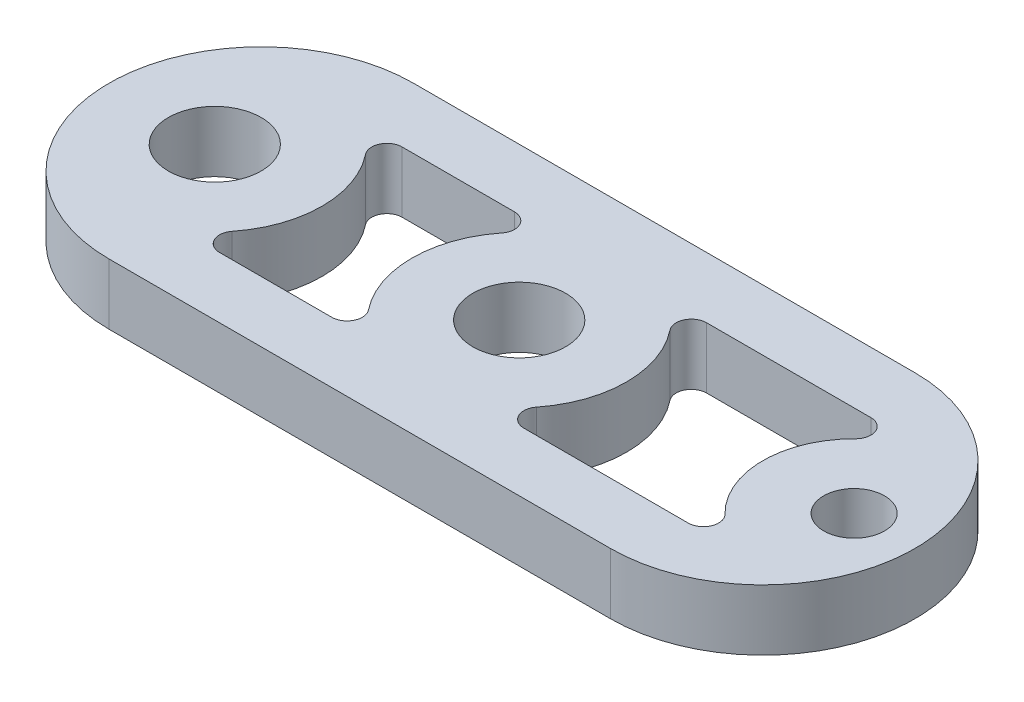
ISO-10303-21;
HEADER;
FILE_DESCRIPTION(('STEP AP214'),'2;1');
FILE_NAME('part.step','',(''),(''),'','','');
FILE_SCHEMA(('AUTOMOTIVE_DESIGN { 1 0 10303 214 1 1 1 1 }'));
ENDSEC;
DATA;
#1=APPLICATION_CONTEXT('core data for automotive mechanical design processes');
#2=APPLICATION_PROTOCOL_DEFINITION('international standard','automotive_design',2000,#1);
#3=PRODUCT_CONTEXT('',#1,'mechanical');
#4=PRODUCT('Part','Part','',(#3));
#5=PRODUCT_RELATED_PRODUCT_CATEGORY('part','',(#4));
#6=PRODUCT_DEFINITION_FORMATION('','',#4);
#7=PRODUCT_DEFINITION_CONTEXT('part definition',#1,'design');
#8=PRODUCT_DEFINITION('design','',#6,#7);
#9=PRODUCT_DEFINITION_SHAPE('','',#8);
#10=(LENGTH_UNIT() NAMED_UNIT(*) SI_UNIT(.MILLI.,.METRE.));
#11=(NAMED_UNIT(*) PLANE_ANGLE_UNIT() SI_UNIT($,.RADIAN.));
#12=(NAMED_UNIT(*) SI_UNIT($,.STERADIAN.) SOLID_ANGLE_UNIT());
#13=UNCERTAINTY_MEASURE_WITH_UNIT(LENGTH_MEASURE(1.E-05),#10,'distance_accuracy_value','');
#14=(GEOMETRIC_REPRESENTATION_CONTEXT(3) GLOBAL_UNCERTAINTY_ASSIGNED_CONTEXT((#13)) GLOBAL_UNIT_ASSIGNED_CONTEXT((#10,
#11,#12)) REPRESENTATION_CONTEXT('',''));
#15=CARTESIAN_POINT('',(0.,0.,0.));
#16=DIRECTION('',(0.,0.,1.));
#17=DIRECTION('',(1.,0.,0.));
#18=AXIS2_PLACEMENT_3D('',#15,#16,#17);
#19=CARTESIAN_POINT('',(3.04999999999778,4.,-1.47391864338542E-12));
#20=DIRECTION('',(0.,1.,0.));
#21=DIRECTION('',(0.,0.,1.));
#22=AXIS2_PLACEMENT_3D('',#19,#20,#21);
#23=PLANE('',#22);
#24=CARTESIAN_POINT('',(-2.23085439010617E-12,4.,-1.47391864338542E-12));
#25=DIRECTION('',(0.,1.,0.));
#26=DIRECTION('',(0.,0.,1.));
#27=AXIS2_PLACEMENT_3D('',#24,#25,#26);
#28=CIRCLE('',#27,3.05000000000001);
#29=CARTESIAN_POINT('',(-2.23085439010617E-12,4.,3.04999999999854));
#30=VERTEX_POINT('',#29);
#31=EDGE_CURVE('E209',#30,#30,#28,.T.);
#32=ORIENTED_EDGE('',*,*,#31,.F.);
#33=EDGE_LOOP('',(#32));
#34=FACE_BOUND('',#33,.T.);
#35=CARTESIAN_POINT('',(3.04999999999778,4.,-1.47391864338542E-12));
#36=DIRECTION('',(0.,1.,0.));
#37=DIRECTION('',(0.,0.,1.));
#38=AXIS2_PLACEMENT_3D('',#35,#36,#37);
#39=CIRCLE('',#38,10.);
#40=CARTESIAN_POINT('',(3.04999999999778,4.,-10.000000000001));
#41=VERTEX_POINT('',#40);
#42=CARTESIAN_POINT('',(3.04999999999778,4.,9.999999999999));
#43=VERTEX_POINT('',#42);
#44=EDGE_CURVE('E304',#41,#43,#39,.T.);
#45=ORIENTED_EDGE('',*,*,#44,.T.);
#46=DIRECTION('',(1.,0.,0.));
#47=VECTOR('',#46,1.);
#48=CARTESIAN_POINT('',(3.04999999999778,4.,9.999999999999));
#49=LINE('',#48,#47);
#50=CARTESIAN_POINT('',(35.9999999999952,4.,9.999999999999));
#51=VERTEX_POINT('',#50);
#52=EDGE_CURVE('E307',#43,#51,#49,.T.);
#53=ORIENTED_EDGE('',*,*,#52,.T.);
#54=CARTESIAN_POINT('',(35.9999999999952,4.,-9.95568644884814E-13));
#55=DIRECTION('',(0.,1.,0.));
#56=DIRECTION('',(0.,0.,1.));
#57=AXIS2_PLACEMENT_3D('',#54,#55,#56);
#58=CIRCLE('',#57,10.);
#59=CARTESIAN_POINT('',(35.9999999999952,4.,-10.000000000001));
#60=VERTEX_POINT('',#59);
#61=EDGE_CURVE('E310',#51,#60,#58,.T.);
#62=ORIENTED_EDGE('',*,*,#61,.T.);
#63=DIRECTION('',(-1.,0.,0.));
#64=VECTOR('',#63,1.);
#65=CARTESIAN_POINT('',(3.04999999999778,4.,-10.000000000001));
#66=LINE('',#65,#64);
#67=EDGE_CURVE('E312',#60,#41,#66,.T.);
#68=ORIENTED_EDGE('',*,*,#67,.T.);
#69=EDGE_LOOP('',(#45,#53,#62,#68));
#70=FACE_BOUND('',#69,.T.);
#71=CARTESIAN_POINT('',(41.9999999999968,4.,-9.95568644884814E-13));
#72=DIRECTION('',(0.,1.,0.));
#73=DIRECTION('',(0.,0.,1.));
#74=AXIS2_PLACEMENT_3D('',#71,#72,#73);
#75=CIRCLE('',#74,2.);
#76=CARTESIAN_POINT('',(41.9999999999968,4.,1.999999999999));
#77=VERTEX_POINT('',#76);
#78=EDGE_CURVE('E298',#77,#77,#75,.T.);
#79=ORIENTED_EDGE('',*,*,#78,.F.);
#80=EDGE_LOOP('',(#79));
#81=FACE_BOUND('',#80,.T.);
#82=DIRECTION('',(-1.,0.,0.));
#83=VECTOR('',#82,1.);
#84=CARTESIAN_POINT('',(26.3089222534407,4.,-6.0000000000038));
#85=LINE('',#84,#83);
#86=CARTESIAN_POINT('',(37.1010205144309,4.,-6.0000000000038));
#87=VERTEX_POINT('',#86);
#88=CARTESIAN_POINT('',(26.3089222534407,4.,-6.0000000000038));
#89=VERTEX_POINT('',#88);
#90=EDGE_CURVE('E241',#87,#89,#85,.T.);
#91=ORIENTED_EDGE('',*,*,#90,.F.);
#92=CARTESIAN_POINT('',(37.1010205144309,4.,-5.0000000000038));
#93=DIRECTION('',(0.,1.,0.));
#94=DIRECTION('',(0.,0.,-1.));
#95=AXIS2_PLACEMENT_3D('',#92,#93,#94);
#96=CIRCLE('',#95,1.);
#97=CARTESIAN_POINT('',(37.8008747266545,4.,-4.28571428571789));
#98=VERTEX_POINT('',#97);
#99=EDGE_CURVE('E239',#98,#87,#96,.T.);
#100=ORIENTED_EDGE('',*,*,#99,.F.);
#101=CARTESIAN_POINT('',(41.9999999999972,4.,-9.95568644884814E-13));
#102=DIRECTION('',(0.,-1.,0.));
#103=DIRECTION('',(0.,0.,1.));
#104=AXIS2_PLACEMENT_3D('',#101,#102,#103);
#105=CIRCLE('',#104,6.00000000000196);
#106=CARTESIAN_POINT('',(37.8008747266547,4.,4.28571428571609));
#107=VERTEX_POINT('',#106);
#108=EDGE_CURVE('E255',#107,#98,#105,.T.);
#109=ORIENTED_EDGE('',*,*,#108,.F.);
#110=CARTESIAN_POINT('',(37.1010205144309,4.,5.00000000000181));
#111=DIRECTION('',(0.,1.,0.));
#112=DIRECTION('',(0.,0.,1.));
#113=AXIS2_PLACEMENT_3D('',#110,#111,#112);
#114=CIRCLE('',#113,1.);
#115=CARTESIAN_POINT('',(37.1010205144309,4.,6.00000000000181));
#116=VERTEX_POINT('',#115);
#117=EDGE_CURVE('E252',#116,#107,#114,.T.);
#118=ORIENTED_EDGE('',*,*,#117,.F.);
#119=DIRECTION('',(1.,0.,0.));
#120=VECTOR('',#119,1.);
#121=CARTESIAN_POINT('',(26.3089222534427,4.,6.00000000000181));
#122=LINE('',#121,#120);
#123=CARTESIAN_POINT('',(26.3089222534427,4.,6.00000000000181));
#124=VERTEX_POINT('',#123);
#125=EDGE_CURVE('E250',#124,#116,#122,.T.);
#126=ORIENTED_EDGE('',*,*,#125,.F.);
#127=CARTESIAN_POINT('',(26.3089222534427,4.,5.00000000000181));
#128=DIRECTION('',(0.,1.,0.));
#129=DIRECTION('',(0.,0.,-1.));
#130=AXIS2_PLACEMENT_3D('',#127,#128,#129);
#131=CIRCLE('',#130,1.);
#132=CARTESIAN_POINT('',(25.5252052033252,4.,4.3788819875797));
#133=VERTEX_POINT('',#132);
#134=EDGE_CURVE('E248',#133,#124,#131,.T.);
#135=ORIENTED_EDGE('',*,*,#134,.F.);
#136=CARTESIAN_POINT('',(19.9999999999981,4.,2.25026160899366E-13));
#137=DIRECTION('',(0.,-1.,0.));
#138=DIRECTION('',(0.,0.,1.));
#139=AXIS2_PLACEMENT_3D('',#136,#137,#138);
#140=CIRCLE('',#139,7.0500000000015);
#141=CARTESIAN_POINT('',(25.5252052033238,4.,-4.37888198758106));
#142=VERTEX_POINT('',#141);
#143=EDGE_CURVE('E246',#142,#133,#140,.T.);
#144=ORIENTED_EDGE('',*,*,#143,.F.);
#145=CARTESIAN_POINT('',(26.3089222534407,4.,-5.0000000000038));
#146=DIRECTION('',(0.,1.,0.));
#147=DIRECTION('',(0.,0.,1.));
#148=AXIS2_PLACEMENT_3D('',#145,#146,#147);
#149=CIRCLE('',#148,1.);
#150=EDGE_CURVE('E244',#89,#142,#149,.T.);
#151=ORIENTED_EDGE('',*,*,#150,.F.);
#152=EDGE_LOOP('',(#91,#100,#109,#118,#126,#135,#144,#151));
#153=FACE_BOUND('',#152,.T.);
#154=CARTESIAN_POINT('',(0.,4.,-3.51727296972795E-12));
#155=DIRECTION('',(0.,-1.,0.));
#156=DIRECTION('',(0.,0.,1.));
#157=AXIS2_PLACEMENT_3D('',#154,#155,#156);
#158=CIRCLE('',#157,7.05000000000055);
#159=CARTESIAN_POINT('',(5.52520520332706,4.,-4.37888198758155));
#160=VERTEX_POINT('',#159);
#161=CARTESIAN_POINT('',(5.52520520332479,4.,4.37888198757724));
#162=VERTEX_POINT('',#161);
#163=EDGE_CURVE('E179',#160,#162,#158,.T.);
#164=ORIENTED_EDGE('',*,*,#163,.F.);
#165=CARTESIAN_POINT('',(6.30892225344428,4.,-5.00000000000358));
#166=DIRECTION('',(0.,1.,0.));
#167=DIRECTION('',(0.,0.,1.));
#168=AXIS2_PLACEMENT_3D('',#165,#166,#167);
#169=CIRCLE('',#168,1.00000000000008);
#170=CARTESIAN_POINT('',(6.30892225344428,4.,-6.00000000000391));
#171=VERTEX_POINT('',#170);
#172=EDGE_CURVE('E171',#171,#160,#169,.T.);
#173=ORIENTED_EDGE('',*,*,#172,.F.);
#174=DIRECTION('',(-1.,0.,0.));
#175=VECTOR('',#174,1.);
#176=CARTESIAN_POINT('',(6.30892225344428,4.,-6.00000000000391));
#177=LINE('',#176,#175);
#178=CARTESIAN_POINT('',(13.6910777465553,4.,-6.00000000000359));
#179=VERTEX_POINT('',#178);
#180=EDGE_CURVE('E206',#179,#171,#177,.T.);
#181=ORIENTED_EDGE('',*,*,#180,.F.);
#182=CARTESIAN_POINT('',(13.6910777465553,4.,-5.00000000000359));
#183=DIRECTION('',(0.,1.,0.));
#184=DIRECTION('',(0.,0.,-1.));
#185=AXIS2_PLACEMENT_3D('',#182,#183,#184);
#186=CIRCLE('',#185,1.);
#187=CARTESIAN_POINT('',(14.4747947966722,4.,-4.37888198758087));
#188=VERTEX_POINT('',#187);
#189=EDGE_CURVE('E204',#188,#179,#186,.T.);
#190=ORIENTED_EDGE('',*,*,#189,.F.);
#191=CARTESIAN_POINT('',(19.9999999999981,4.,2.25026160899366E-13));
#192=DIRECTION('',(0.,-1.,0.));
#193=DIRECTION('',(0.,0.,1.));
#194=AXIS2_PLACEMENT_3D('',#191,#192,#193);
#195=CIRCLE('',#194,7.0500000000015);
#196=CARTESIAN_POINT('',(14.4747947966692,4.,4.37888198757747));
#197=VERTEX_POINT('',#196);
#198=EDGE_CURVE('E202',#197,#188,#195,.T.);
#199=ORIENTED_EDGE('',*,*,#198,.F.);
#200=CARTESIAN_POINT('',(13.6910777465518,4.,4.99999999999964));
#201=DIRECTION('',(0.,1.,0.));
#202=DIRECTION('',(0.,0.,1.));
#203=AXIS2_PLACEMENT_3D('',#200,#201,#202);
#204=CIRCLE('',#203,1.);
#205=CARTESIAN_POINT('',(13.6910777465523,4.,5.99999999999964));
#206=VERTEX_POINT('',#205);
#207=EDGE_CURVE('E200',#206,#197,#204,.T.);
#208=ORIENTED_EDGE('',*,*,#207,.F.);
#209=DIRECTION('',(1.,0.,0.));
#210=VECTOR('',#209,1.);
#211=CARTESIAN_POINT('',(6.30892225344184,4.,5.99999999999964));
#212=LINE('',#211,#210);
#213=CARTESIAN_POINT('',(6.30892225344184,4.,5.99999999999964));
#214=VERTEX_POINT('',#213);
#215=EDGE_CURVE('E195',#214,#206,#212,.T.);
#216=ORIENTED_EDGE('',*,*,#215,.F.);
#217=CARTESIAN_POINT('',(6.30892225344184,4.,4.99999999999964));
#218=DIRECTION('',(0.,1.,0.));
#219=DIRECTION('',(0.,0.,-1.));
#220=AXIS2_PLACEMENT_3D('',#217,#218,#219);
#221=CIRCLE('',#220,0.999999999999858);
#222=EDGE_CURVE('E193',#162,#214,#221,.T.);
#223=ORIENTED_EDGE('',*,*,#222,.F.);
#224=EDGE_LOOP('',(#164,#173,#181,#190,#199,#208,#216,#223));
#225=FACE_BOUND('',#224,.T.);
#226=CARTESIAN_POINT('',(19.9999999999968,4.,-9.0839879021698E-13));
#227=DIRECTION('',(0.,1.,0.));
#228=DIRECTION('',(0.,0.,1.));
#229=AXIS2_PLACEMENT_3D('',#226,#227,#228);
#230=CIRCLE('',#229,3.05000000000148);
#231=CARTESIAN_POINT('',(19.9999999999968,4.,3.05000000000057));
#232=VERTEX_POINT('',#231);
#233=EDGE_CURVE('E392',#232,#232,#230,.T.);
#234=ORIENTED_EDGE('',*,*,#233,.F.);
#235=EDGE_LOOP('',(#234));
#236=FACE_BOUND('',#235,.T.);
#237=ADVANCED_FACE('F34',(#34,#70,#81,#153,#225,#236),#23,.T.);
#238=CARTESIAN_POINT('',(3.04999999999778,0.,-1.47391864338542E-12));
#239=DIRECTION('',(0.,1.,0.));
#240=DIRECTION('',(0.,0.,1.));
#241=AXIS2_PLACEMENT_3D('',#238,#239,#240);
#242=PLANE('',#241);
#243=CARTESIAN_POINT('',(37.1010205144309,0.,-5.0000000000038));
#244=DIRECTION('',(0.,1.,0.));
#245=DIRECTION('',(0.,0.,-1.));
#246=AXIS2_PLACEMENT_3D('',#243,#244,#245);
#247=CIRCLE('',#246,1.);
#248=CARTESIAN_POINT('',(37.8008747266545,0.,-4.28571428571789));
#249=VERTEX_POINT('',#248);
#250=CARTESIAN_POINT('',(37.1010205144309,0.,-6.0000000000038));
#251=VERTEX_POINT('',#250);
#252=EDGE_CURVE('E187',#249,#251,#247,.T.);
#253=ORIENTED_EDGE('',*,*,#252,.T.);
#254=DIRECTION('',(-1.,0.,0.));
#255=VECTOR('',#254,1.);
#256=CARTESIAN_POINT('',(26.3089222534407,0.,-6.0000000000038));
#257=LINE('',#256,#255);
#258=CARTESIAN_POINT('',(26.3089222534407,0.,-6.0000000000038));
#259=VERTEX_POINT('',#258);
#260=EDGE_CURVE('E260',#251,#259,#257,.T.);
#261=ORIENTED_EDGE('',*,*,#260,.T.);
#262=CARTESIAN_POINT('',(26.3089222534407,0.,-5.0000000000038));
#263=DIRECTION('',(0.,1.,0.));
#264=DIRECTION('',(0.,0.,1.));
#265=AXIS2_PLACEMENT_3D('',#262,#263,#264);
#266=CIRCLE('',#265,1.);
#267=CARTESIAN_POINT('',(25.5252052033238,0.,-4.37888198758106));
#268=VERTEX_POINT('',#267);
#269=EDGE_CURVE('E263',#259,#268,#266,.T.);
#270=ORIENTED_EDGE('',*,*,#269,.T.);
#271=CARTESIAN_POINT('',(19.9999999999981,0.,2.25026160899366E-13));
#272=DIRECTION('',(0.,-1.,0.));
#273=DIRECTION('',(0.,0.,1.));
#274=AXIS2_PLACEMENT_3D('',#271,#272,#273);
#275=CIRCLE('',#274,7.0500000000015);
#276=CARTESIAN_POINT('',(25.5252052033252,0.,4.3788819875797));
#277=VERTEX_POINT('',#276);
#278=EDGE_CURVE('E266',#268,#277,#275,.T.);
#279=ORIENTED_EDGE('',*,*,#278,.T.);
#280=CARTESIAN_POINT('',(26.3089222534427,0.,5.00000000000181));
#281=DIRECTION('',(0.,1.,0.));
#282=DIRECTION('',(0.,0.,-1.));
#283=AXIS2_PLACEMENT_3D('',#280,#281,#282);
#284=CIRCLE('',#283,1.);
#285=CARTESIAN_POINT('',(26.3089222534427,0.,6.00000000000181));
#286=VERTEX_POINT('',#285);
#287=EDGE_CURVE('E269',#277,#286,#284,.T.);
#288=ORIENTED_EDGE('',*,*,#287,.T.);
#289=DIRECTION('',(1.,0.,0.));
#290=VECTOR('',#289,1.);
#291=CARTESIAN_POINT('',(26.3089222534427,0.,6.00000000000181));
#292=LINE('',#291,#290);
#293=CARTESIAN_POINT('',(37.1010205144309,0.,6.00000000000181));
#294=VERTEX_POINT('',#293);
#295=EDGE_CURVE('E272',#286,#294,#292,.T.);
#296=ORIENTED_EDGE('',*,*,#295,.T.);
#297=CARTESIAN_POINT('',(37.1010205144309,0.,5.00000000000181));
#298=DIRECTION('',(0.,1.,0.));
#299=DIRECTION('',(0.,0.,1.));
#300=AXIS2_PLACEMENT_3D('',#297,#298,#299);
#301=CIRCLE('',#300,1.);
#302=CARTESIAN_POINT('',(37.8008747266547,0.,4.28571428571609));
#303=VERTEX_POINT('',#302);
#304=EDGE_CURVE('E275',#294,#303,#301,.T.);
#305=ORIENTED_EDGE('',*,*,#304,.T.);
#306=CARTESIAN_POINT('',(41.9999999999972,0.,-9.95568644884814E-13));
#307=DIRECTION('',(0.,-1.,0.));
#308=DIRECTION('',(0.,0.,1.));
#309=AXIS2_PLACEMENT_3D('',#306,#307,#308);
#310=CIRCLE('',#309,6.00000000000196);
#311=EDGE_CURVE('E242',#303,#249,#310,.T.);
#312=ORIENTED_EDGE('',*,*,#311,.T.);
#313=EDGE_LOOP('',(#253,#261,#270,#279,#288,#296,#305,#312));
#314=FACE_BOUND('',#313,.T.);
#315=CARTESIAN_POINT('',(3.04999999999778,0.,-1.47391864338542E-12));
#316=DIRECTION('',(0.,1.,0.));
#317=DIRECTION('',(0.,0.,1.));
#318=AXIS2_PLACEMENT_3D('',#315,#316,#317);
#319=CIRCLE('',#318,10.);
#320=CARTESIAN_POINT('',(3.04999999999778,0.,-10.000000000001));
#321=VERTEX_POINT('',#320);
#322=CARTESIAN_POINT('',(3.04999999999778,0.,9.999999999999));
#323=VERTEX_POINT('',#322);
#324=EDGE_CURVE('E301',#321,#323,#319,.T.);
#325=ORIENTED_EDGE('',*,*,#324,.F.);
#326=DIRECTION('',(-1.,0.,0.));
#327=VECTOR('',#326,1.);
#328=CARTESIAN_POINT('',(3.04999999999778,0.,-10.000000000001));
#329=LINE('',#328,#327);
#330=CARTESIAN_POINT('',(35.9999999999952,0.,-10.000000000001));
#331=VERTEX_POINT('',#330);
#332=EDGE_CURVE('E308',#331,#321,#329,.T.);
#333=ORIENTED_EDGE('',*,*,#332,.F.);
#334=CARTESIAN_POINT('',(35.9999999999952,0.,-9.95568644884814E-13));
#335=DIRECTION('',(0.,1.,0.));
#336=DIRECTION('',(0.,0.,1.));
#337=AXIS2_PLACEMENT_3D('',#334,#335,#336);
#338=CIRCLE('',#337,10.);
#339=CARTESIAN_POINT('',(35.9999999999952,0.,9.999999999999));
#340=VERTEX_POINT('',#339);
#341=EDGE_CURVE('E319',#340,#331,#338,.T.);
#342=ORIENTED_EDGE('',*,*,#341,.F.);
#343=DIRECTION('',(1.,0.,0.));
#344=VECTOR('',#343,1.);
#345=CARTESIAN_POINT('',(3.04999999999778,0.,9.999999999999));
#346=LINE('',#345,#344);
#347=EDGE_CURVE('E317',#323,#340,#346,.T.);
#348=ORIENTED_EDGE('',*,*,#347,.F.);
#349=EDGE_LOOP('',(#325,#333,#342,#348));
#350=FACE_BOUND('',#349,.T.);
#351=CARTESIAN_POINT('',(41.9999999999968,0.,-9.95568644884814E-13));
#352=DIRECTION('',(0.,1.,0.));
#353=DIRECTION('',(0.,0.,1.));
#354=AXIS2_PLACEMENT_3D('',#351,#352,#353);
#355=CIRCLE('',#354,2.);
#356=CARTESIAN_POINT('',(41.9999999999968,0.,1.999999999999));
#357=VERTEX_POINT('',#356);
#358=EDGE_CURVE('E297',#357,#357,#355,.T.);
#359=ORIENTED_EDGE('',*,*,#358,.T.);
#360=EDGE_LOOP('',(#359));
#361=FACE_BOUND('',#360,.T.);
#362=CARTESIAN_POINT('',(6.30892225344428,0.,-5.00000000000358));
#363=DIRECTION('',(0.,1.,0.));
#364=DIRECTION('',(0.,0.,1.));
#365=AXIS2_PLACEMENT_3D('',#362,#363,#364);
#366=CIRCLE('',#365,1.00000000000008);
#367=CARTESIAN_POINT('',(6.30892225344428,0.,-6.00000000000391));
#368=VERTEX_POINT('',#367);
#369=CARTESIAN_POINT('',(5.52520520332706,0.,-4.37888198758155));
#370=VERTEX_POINT('',#369);
#371=EDGE_CURVE('E57',#368,#370,#366,.T.);
#372=ORIENTED_EDGE('',*,*,#371,.T.);
#373=CARTESIAN_POINT('',(0.,0.,-3.51727296972795E-12));
#374=DIRECTION('',(0.,-1.,0.));
#375=DIRECTION('',(0.,0.,1.));
#376=AXIS2_PLACEMENT_3D('',#373,#374,#375);
#377=CIRCLE('',#376,7.05000000000055);
#378=CARTESIAN_POINT('',(5.52520520332479,0.,4.37888198757724));
#379=VERTEX_POINT('',#378);
#380=EDGE_CURVE('E186',#370,#379,#377,.T.);
#381=ORIENTED_EDGE('',*,*,#380,.T.);
#382=CARTESIAN_POINT('',(6.30892225344184,0.,4.99999999999964));
#383=DIRECTION('',(0.,1.,0.));
#384=DIRECTION('',(0.,0.,-1.));
#385=AXIS2_PLACEMENT_3D('',#382,#383,#384);
#386=CIRCLE('',#385,0.999999999999858);
#387=CARTESIAN_POINT('',(6.30892225344184,0.,5.99999999999964));
#388=VERTEX_POINT('',#387);
#389=EDGE_CURVE('E211',#379,#388,#386,.T.);
#390=ORIENTED_EDGE('',*,*,#389,.T.);
#391=DIRECTION('',(1.,0.,0.));
#392=VECTOR('',#391,1.);
#393=CARTESIAN_POINT('',(6.30892225344184,0.,5.99999999999964));
#394=LINE('',#393,#392);
#395=CARTESIAN_POINT('',(13.6910777465523,0.,5.99999999999964));
#396=VERTEX_POINT('',#395);
#397=EDGE_CURVE('E214',#388,#396,#394,.T.);
#398=ORIENTED_EDGE('',*,*,#397,.T.);
#399=CARTESIAN_POINT('',(13.6910777465518,0.,4.99999999999964));
#400=DIRECTION('',(0.,1.,0.));
#401=DIRECTION('',(0.,0.,1.));
#402=AXIS2_PLACEMENT_3D('',#399,#400,#401);
#403=CIRCLE('',#402,1.);
#404=CARTESIAN_POINT('',(14.4747947966692,0.,4.37888198757747));
#405=VERTEX_POINT('',#404);
#406=EDGE_CURVE('E217',#396,#405,#403,.T.);
#407=ORIENTED_EDGE('',*,*,#406,.T.);
#408=CARTESIAN_POINT('',(19.9999999999981,0.,2.25026160899366E-13));
#409=DIRECTION('',(0.,-1.,0.));
#410=DIRECTION('',(0.,0.,1.));
#411=AXIS2_PLACEMENT_3D('',#408,#409,#410);
#412=CIRCLE('',#411,7.0500000000015);
#413=CARTESIAN_POINT('',(14.4747947966722,0.,-4.37888198758087));
#414=VERTEX_POINT('',#413);
#415=EDGE_CURVE('E220',#405,#414,#412,.T.);
#416=ORIENTED_EDGE('',*,*,#415,.T.);
#417=CARTESIAN_POINT('',(13.6910777465553,0.,-5.00000000000359));
#418=DIRECTION('',(0.,1.,0.));
#419=DIRECTION('',(0.,0.,-1.));
#420=AXIS2_PLACEMENT_3D('',#417,#418,#419);
#421=CIRCLE('',#420,1.);
#422=CARTESIAN_POINT('',(13.6910777465553,0.,-6.00000000000359));
#423=VERTEX_POINT('',#422);
#424=EDGE_CURVE('E223',#414,#423,#421,.T.);
#425=ORIENTED_EDGE('',*,*,#424,.T.);
#426=DIRECTION('',(-1.,0.,0.));
#427=VECTOR('',#426,1.);
#428=CARTESIAN_POINT('',(6.30892225344428,0.,-6.00000000000391));
#429=LINE('',#428,#427);
#430=EDGE_CURVE('E180',#423,#368,#429,.T.);
#431=ORIENTED_EDGE('',*,*,#430,.T.);
#432=EDGE_LOOP('',(#372,#381,#390,#398,#407,#416,#425,#431));
#433=FACE_BOUND('',#432,.T.);
#434=CARTESIAN_POINT('',(-2.23085439010617E-12,0.,-1.47391864338542E-12));
#435=DIRECTION('',(0.,1.,0.));
#436=DIRECTION('',(0.,0.,1.));
#437=AXIS2_PLACEMENT_3D('',#434,#435,#436);
#438=CIRCLE('',#437,3.05000000000001);
#439=CARTESIAN_POINT('',(-2.23085439010617E-12,0.,3.04999999999854));
#440=VERTEX_POINT('',#439);
#441=EDGE_CURVE('E387',#440,#440,#438,.T.);
#442=ORIENTED_EDGE('',*,*,#441,.T.);
#443=EDGE_LOOP('',(#442));
#444=FACE_BOUND('',#443,.T.);
#445=CARTESIAN_POINT('',(19.9999999999968,0.,-9.0839879021698E-13));
#446=DIRECTION('',(0.,1.,0.));
#447=DIRECTION('',(0.,0.,1.));
#448=AXIS2_PLACEMENT_3D('',#445,#446,#447);
#449=CIRCLE('',#448,3.05000000000148);
#450=CARTESIAN_POINT('',(19.9999999999968,0.,3.05000000000057));
#451=VERTEX_POINT('',#450);
#452=EDGE_CURVE('E390',#451,#451,#449,.T.);
#453=ORIENTED_EDGE('',*,*,#452,.T.);
#454=EDGE_LOOP('',(#453));
#455=FACE_BOUND('',#454,.T.);
#456=ADVANCED_FACE('F337',(#314,#350,#361,#433,#444,#455),#242,.F.);
#457=CARTESIAN_POINT('',(3.04999999999778,4.,-1.47391864338542E-12));
#458=DIRECTION('',(0.,-1.,0.));
#459=DIRECTION('',(0.,0.,-1.));
#460=AXIS2_PLACEMENT_3D('',#457,#458,#459);
#461=CYLINDRICAL_SURFACE('',#460,10.);
#462=ORIENTED_EDGE('',*,*,#324,.T.);
#463=DIRECTION('',(0.,-1.,0.));
#464=VECTOR('',#463,1.);
#465=CARTESIAN_POINT('',(3.04999999999778,4.,9.999999999999));
#466=LINE('',#465,#464);
#467=EDGE_CURVE('E11',#43,#323,#466,.T.);
#468=ORIENTED_EDGE('',*,*,#467,.F.);
#469=ORIENTED_EDGE('',*,*,#44,.F.);
#470=DIRECTION('',(0.,-1.,0.));
#471=VECTOR('',#470,1.);
#472=CARTESIAN_POINT('',(3.04999999999778,4.,-10.000000000001));
#473=LINE('',#472,#471);
#474=EDGE_CURVE('E314',#41,#321,#473,.T.);
#475=ORIENTED_EDGE('',*,*,#474,.T.);
#476=EDGE_LOOP('',(#462,#468,#469,#475));
#477=FACE_BOUND('',#476,.T.);
#478=ADVANCED_FACE('F36',(#477),#461,.T.);
#479=CARTESIAN_POINT('',(3.04999999999778,4.,9.999999999999));
#480=DIRECTION('',(0.,0.,-1.));
#481=DIRECTION('',(-1.,0.,0.));
#482=AXIS2_PLACEMENT_3D('',#479,#480,#481);
#483=PLANE('',#482);
#484=ORIENTED_EDGE('',*,*,#347,.T.);
#485=DIRECTION('',(0.,-1.,0.));
#486=VECTOR('',#485,1.);
#487=CARTESIAN_POINT('',(35.9999999999952,4.,9.999999999999));
#488=LINE('',#487,#486);
#489=EDGE_CURVE('E42',#51,#340,#488,.T.);
#490=ORIENTED_EDGE('',*,*,#489,.F.);
#491=ORIENTED_EDGE('',*,*,#52,.F.);
#492=ORIENTED_EDGE('',*,*,#467,.T.);
#493=EDGE_LOOP('',(#484,#490,#491,#492));
#494=FACE_BOUND('',#493,.T.);
#495=ADVANCED_FACE('F348',(#494),#483,.F.);
#496=CARTESIAN_POINT('',(35.9999999999952,4.,-9.95568644884814E-13));
#497=DIRECTION('',(0.,-1.,0.));
#498=DIRECTION('',(0.,0.,-1.));
#499=AXIS2_PLACEMENT_3D('',#496,#497,#498);
#500=CYLINDRICAL_SURFACE('',#499,10.);
#501=ORIENTED_EDGE('',*,*,#341,.T.);
#502=DIRECTION('',(0.,-1.,0.));
#503=VECTOR('',#502,1.);
#504=CARTESIAN_POINT('',(35.9999999999952,4.,-10.000000000001));
#505=LINE('',#504,#503);
#506=EDGE_CURVE('E324',#60,#331,#505,.T.);
#507=ORIENTED_EDGE('',*,*,#506,.F.);
#508=ORIENTED_EDGE('',*,*,#61,.F.);
#509=ORIENTED_EDGE('',*,*,#489,.T.);
#510=EDGE_LOOP('',(#501,#507,#508,#509));
#511=FACE_BOUND('',#510,.T.);
#512=ADVANCED_FACE('F331',(#511),#500,.T.);
#513=CARTESIAN_POINT('',(3.04999999999778,4.,-10.000000000001));
#514=DIRECTION('',(0.,0.,1.));
#515=DIRECTION('',(1.,0.,0.));
#516=AXIS2_PLACEMENT_3D('',#513,#514,#515);
#517=PLANE('',#516);
#518=ORIENTED_EDGE('',*,*,#332,.T.);
#519=ORIENTED_EDGE('',*,*,#474,.F.);
#520=ORIENTED_EDGE('',*,*,#67,.F.);
#521=ORIENTED_EDGE('',*,*,#506,.T.);
#522=EDGE_LOOP('',(#518,#519,#520,#521));
#523=FACE_BOUND('',#522,.T.);
#524=ADVANCED_FACE('F341',(#523),#517,.F.);
#525=CARTESIAN_POINT('',(41.9999999999968,4.,-9.95568644884814E-13));
#526=DIRECTION('',(0.,-1.,0.));
#527=DIRECTION('',(0.,0.,-1.));
#528=AXIS2_PLACEMENT_3D('',#525,#526,#527);
#529=CYLINDRICAL_SURFACE('',#528,2.);
#530=ORIENTED_EDGE('',*,*,#78,.T.);
#531=EDGE_LOOP('',(#530));
#532=FACE_BOUND('',#531,.T.);
#533=ORIENTED_EDGE('',*,*,#358,.F.);
#534=EDGE_LOOP('',(#533));
#535=FACE_BOUND('',#534,.T.);
#536=ADVANCED_FACE('F365',(#532,#535),#529,.F.);
#537=CARTESIAN_POINT('',(37.1010205144309,4.,-5.0000000000038));
#538=DIRECTION('',(0.,-1.,0.));
#539=DIRECTION('',(0.,0.,-1.));
#540=AXIS2_PLACEMENT_3D('',#537,#538,#539);
#541=CYLINDRICAL_SURFACE('',#540,1.);
#542=ORIENTED_EDGE('',*,*,#252,.F.);
#543=DIRECTION('',(0.,-1.,0.));
#544=VECTOR('',#543,1.);
#545=CARTESIAN_POINT('',(37.8008747266545,4.,-4.28571428571789));
#546=LINE('',#545,#544);
#547=EDGE_CURVE('E257',#98,#249,#546,.T.);
#548=ORIENTED_EDGE('',*,*,#547,.F.);
#549=ORIENTED_EDGE('',*,*,#99,.T.);
#550=DIRECTION('',(0.,-1.,0.));
#551=VECTOR('',#550,1.);
#552=CARTESIAN_POINT('',(37.1010205144309,4.,-6.0000000000038));
#553=LINE('',#552,#551);
#554=EDGE_CURVE('E294',#87,#251,#553,.T.);
#555=ORIENTED_EDGE('',*,*,#554,.T.);
#556=EDGE_LOOP('',(#542,#548,#549,#555));
#557=FACE_BOUND('',#556,.T.);
#558=ADVANCED_FACE('F372',(#557),#541,.F.);
#559=CARTESIAN_POINT('',(26.3089222534407,4.,-6.0000000000038));
#560=DIRECTION('',(0.,0.,1.));
#561=DIRECTION('',(1.,0.,0.));
#562=AXIS2_PLACEMENT_3D('',#559,#560,#561);
#563=PLANE('',#562);
#564=ORIENTED_EDGE('',*,*,#260,.F.);
#565=ORIENTED_EDGE('',*,*,#554,.F.);
#566=ORIENTED_EDGE('',*,*,#90,.T.);
#567=DIRECTION('',(0.,-1.,0.));
#568=VECTOR('',#567,1.);
#569=CARTESIAN_POINT('',(26.3089222534407,4.,-6.0000000000038));
#570=LINE('',#569,#568);
#571=EDGE_CURVE('E292',#89,#259,#570,.T.);
#572=ORIENTED_EDGE('',*,*,#571,.T.);
#573=EDGE_LOOP('',(#564,#565,#566,#572));
#574=FACE_BOUND('',#573,.T.);
#575=ADVANCED_FACE('F377',(#574),#563,.T.);
#576=CARTESIAN_POINT('',(26.3089222534407,4.,-5.0000000000038));
#577=DIRECTION('',(0.,-1.,0.));
#578=DIRECTION('',(0.,0.,-1.));
#579=AXIS2_PLACEMENT_3D('',#576,#577,#578);
#580=CYLINDRICAL_SURFACE('',#579,1.);
#581=ORIENTED_EDGE('',*,*,#269,.F.);
#582=ORIENTED_EDGE('',*,*,#571,.F.);
#583=ORIENTED_EDGE('',*,*,#150,.T.);
#584=DIRECTION('',(0.,-1.,0.));
#585=VECTOR('',#584,1.);
#586=CARTESIAN_POINT('',(25.5252052033238,4.,-4.37888198758106));
#587=LINE('',#586,#585);
#588=EDGE_CURVE('E290',#142,#268,#587,.T.);
#589=ORIENTED_EDGE('',*,*,#588,.T.);
#590=EDGE_LOOP('',(#581,#582,#583,#589));
#591=FACE_BOUND('',#590,.T.);
#592=ADVANCED_FACE('F456',(#591),#580,.F.);
#593=CARTESIAN_POINT('',(19.9999999999981,4.,2.25026160899366E-13));
#594=DIRECTION('',(0.,-1.,0.));
#595=DIRECTION('',(0.,0.,-1.));
#596=AXIS2_PLACEMENT_3D('',#593,#594,#595);
#597=CYLINDRICAL_SURFACE('',#596,7.0500000000015);
#598=ORIENTED_EDGE('',*,*,#278,.F.);
#599=ORIENTED_EDGE('',*,*,#588,.F.);
#600=ORIENTED_EDGE('',*,*,#143,.T.);
#601=DIRECTION('',(0.,-1.,0.));
#602=VECTOR('',#601,1.);
#603=CARTESIAN_POINT('',(25.5252052033252,4.,4.3788819875797));
#604=LINE('',#603,#602);
#605=EDGE_CURVE('E288',#133,#277,#604,.T.);
#606=ORIENTED_EDGE('',*,*,#605,.T.);
#607=EDGE_LOOP('',(#598,#599,#600,#606));
#608=FACE_BOUND('',#607,.T.);
#609=ADVANCED_FACE('F452',(#608),#597,.T.);
#610=CARTESIAN_POINT('',(26.3089222534427,4.,5.00000000000181));
#611=DIRECTION('',(0.,-1.,0.));
#612=DIRECTION('',(0.,0.,-1.));
#613=AXIS2_PLACEMENT_3D('',#610,#611,#612);
#614=CYLINDRICAL_SURFACE('',#613,1.);
#615=ORIENTED_EDGE('',*,*,#287,.F.);
#616=ORIENTED_EDGE('',*,*,#605,.F.);
#617=ORIENTED_EDGE('',*,*,#134,.T.);
#618=DIRECTION('',(0.,-1.,0.));
#619=VECTOR('',#618,1.);
#620=CARTESIAN_POINT('',(26.3089222534427,4.,6.00000000000181));
#621=LINE('',#620,#619);
#622=EDGE_CURVE('E286',#124,#286,#621,.T.);
#623=ORIENTED_EDGE('',*,*,#622,.T.);
#624=EDGE_LOOP('',(#615,#616,#617,#623));
#625=FACE_BOUND('',#624,.T.);
#626=ADVANCED_FACE('F448',(#625),#614,.F.);
#627=CARTESIAN_POINT('',(26.3089222534427,4.,6.00000000000181));
#628=DIRECTION('',(0.,0.,-1.));
#629=DIRECTION('',(-1.,0.,0.));
#630=AXIS2_PLACEMENT_3D('',#627,#628,#629);
#631=PLANE('',#630);
#632=ORIENTED_EDGE('',*,*,#295,.F.);
#633=ORIENTED_EDGE('',*,*,#622,.F.);
#634=ORIENTED_EDGE('',*,*,#125,.T.);
#635=DIRECTION('',(0.,-1.,0.));
#636=VECTOR('',#635,1.);
#637=CARTESIAN_POINT('',(37.1010205144309,4.,6.00000000000181));
#638=LINE('',#637,#636);
#639=EDGE_CURVE('E284',#116,#294,#638,.T.);
#640=ORIENTED_EDGE('',*,*,#639,.T.);
#641=EDGE_LOOP('',(#632,#633,#634,#640));
#642=FACE_BOUND('',#641,.T.);
#643=ADVANCED_FACE('F444',(#642),#631,.T.);
#644=CARTESIAN_POINT('',(37.1010205144309,4.,5.00000000000181));
#645=DIRECTION('',(0.,-1.,0.));
#646=DIRECTION('',(0.,0.,-1.));
#647=AXIS2_PLACEMENT_3D('',#644,#645,#646);
#648=CYLINDRICAL_SURFACE('',#647,1.);
#649=ORIENTED_EDGE('',*,*,#304,.F.);
#650=ORIENTED_EDGE('',*,*,#639,.F.);
#651=ORIENTED_EDGE('',*,*,#117,.T.);
#652=DIRECTION('',(0.,-1.,0.));
#653=VECTOR('',#652,1.);
#654=CARTESIAN_POINT('',(37.8008747266547,4.,4.28571428571609));
#655=LINE('',#654,#653);
#656=EDGE_CURVE('E282',#107,#303,#655,.T.);
#657=ORIENTED_EDGE('',*,*,#656,.T.);
#658=EDGE_LOOP('',(#649,#650,#651,#657));
#659=FACE_BOUND('',#658,.T.);
#660=ADVANCED_FACE('F440',(#659),#648,.F.);
#661=CARTESIAN_POINT('',(41.9999999999972,4.,-9.95568644884814E-13));
#662=DIRECTION('',(0.,-1.,0.));
#663=DIRECTION('',(0.,0.,-1.));
#664=AXIS2_PLACEMENT_3D('',#661,#662,#663);
#665=CYLINDRICAL_SURFACE('',#664,6.00000000000196);
#666=ORIENTED_EDGE('',*,*,#311,.F.);
#667=ORIENTED_EDGE('',*,*,#656,.F.);
#668=ORIENTED_EDGE('',*,*,#108,.T.);
#669=ORIENTED_EDGE('',*,*,#547,.T.);
#670=EDGE_LOOP('',(#666,#667,#668,#669));
#671=FACE_BOUND('',#670,.T.);
#672=ADVANCED_FACE('F437',(#671),#665,.T.);
#673=CARTESIAN_POINT('',(6.30892225344428,4.,-5.00000000000358));
#674=DIRECTION('',(0.,-1.,0.));
#675=DIRECTION('',(0.,0.,-1.));
#676=AXIS2_PLACEMENT_3D('',#673,#674,#675);
#677=CYLINDRICAL_SURFACE('',#676,1.00000000000008);
#678=ORIENTED_EDGE('',*,*,#371,.F.);
#679=DIRECTION('',(0.,-1.,0.));
#680=VECTOR('',#679,1.);
#681=CARTESIAN_POINT('',(6.30892225344428,4.,-6.00000000000391));
#682=LINE('',#681,#680);
#683=EDGE_CURVE('E175',#171,#368,#682,.T.);
#684=ORIENTED_EDGE('',*,*,#683,.F.);
#685=ORIENTED_EDGE('',*,*,#172,.T.);
#686=DIRECTION('',(0.,-1.,0.));
#687=VECTOR('',#686,1.);
#688=CARTESIAN_POINT('',(5.52520520332706,4.,-4.37888198758155));
#689=LINE('',#688,#687);
#690=EDGE_CURVE('E174',#160,#370,#689,.T.);
#691=ORIENTED_EDGE('',*,*,#690,.T.);
#692=EDGE_LOOP('',(#678,#684,#685,#691));
#693=FACE_BOUND('',#692,.T.);
#694=ADVANCED_FACE('F173',(#693),#677,.F.);
#695=CARTESIAN_POINT('',(0.,4.,-3.51727296972795E-12));
#696=DIRECTION('',(0.,-1.,0.));
#697=DIRECTION('',(0.,0.,-1.));
#698=AXIS2_PLACEMENT_3D('',#695,#696,#697);
#699=CYLINDRICAL_SURFACE('',#698,7.05000000000055);
#700=ORIENTED_EDGE('',*,*,#380,.F.);
#701=ORIENTED_EDGE('',*,*,#690,.F.);
#702=ORIENTED_EDGE('',*,*,#163,.T.);
#703=DIRECTION('',(0.,-1.,0.));
#704=VECTOR('',#703,1.);
#705=CARTESIAN_POINT('',(5.52520520332479,4.,4.37888198757724));
#706=LINE('',#705,#704);
#707=EDGE_CURVE('E188',#162,#379,#706,.T.);
#708=ORIENTED_EDGE('',*,*,#707,.T.);
#709=EDGE_LOOP('',(#700,#701,#702,#708));
#710=FACE_BOUND('',#709,.T.);
#711=ADVANCED_FACE('F183',(#710),#699,.T.);
#712=CARTESIAN_POINT('',(6.30892225344184,4.,4.99999999999964));
#713=DIRECTION('',(0.,-1.,0.));
#714=DIRECTION('',(0.,0.,-1.));
#715=AXIS2_PLACEMENT_3D('',#712,#713,#714);
#716=CYLINDRICAL_SURFACE('',#715,0.999999999999858);
#717=ORIENTED_EDGE('',*,*,#389,.F.);
#718=ORIENTED_EDGE('',*,*,#707,.F.);
#719=ORIENTED_EDGE('',*,*,#222,.T.);
#720=DIRECTION('',(0.,-1.,0.));
#721=VECTOR('',#720,1.);
#722=CARTESIAN_POINT('',(6.30892225344184,4.,5.99999999999964));
#723=LINE('',#722,#721);
#724=EDGE_CURVE('E236',#214,#388,#723,.T.);
#725=ORIENTED_EDGE('',*,*,#724,.T.);
#726=EDGE_LOOP('',(#717,#718,#719,#725));
#727=FACE_BOUND('',#726,.T.);
#728=ADVANCED_FACE('F428',(#727),#716,.F.);
#729=CARTESIAN_POINT('',(6.30892225344184,4.,5.99999999999964));
#730=DIRECTION('',(0.,0.,-1.));
#731=DIRECTION('',(-1.,0.,0.));
#732=AXIS2_PLACEMENT_3D('',#729,#730,#731);
#733=PLANE('',#732);
#734=ORIENTED_EDGE('',*,*,#397,.F.);
#735=ORIENTED_EDGE('',*,*,#724,.F.);
#736=ORIENTED_EDGE('',*,*,#215,.T.);
#737=DIRECTION('',(0.,-1.,0.));
#738=VECTOR('',#737,1.);
#739=CARTESIAN_POINT('',(13.6910777465523,4.,5.99999999999964));
#740=LINE('',#739,#738);
#741=EDGE_CURVE('E234',#206,#396,#740,.T.);
#742=ORIENTED_EDGE('',*,*,#741,.T.);
#743=EDGE_LOOP('',(#734,#735,#736,#742));
#744=FACE_BOUND('',#743,.T.);
#745=ADVANCED_FACE('F424',(#744),#733,.T.);
#746=CARTESIAN_POINT('',(13.6910777465518,4.,4.99999999999964));
#747=DIRECTION('',(0.,-1.,0.));
#748=DIRECTION('',(0.,0.,-1.));
#749=AXIS2_PLACEMENT_3D('',#746,#747,#748);
#750=CYLINDRICAL_SURFACE('',#749,1.);
#751=ORIENTED_EDGE('',*,*,#406,.F.);
#752=ORIENTED_EDGE('',*,*,#741,.F.);
#753=ORIENTED_EDGE('',*,*,#207,.T.);
#754=DIRECTION('',(0.,-1.,0.));
#755=VECTOR('',#754,1.);
#756=CARTESIAN_POINT('',(14.4747947966692,4.,4.37888198757747));
#757=LINE('',#756,#755);
#758=EDGE_CURVE('E232',#197,#405,#757,.T.);
#759=ORIENTED_EDGE('',*,*,#758,.T.);
#760=EDGE_LOOP('',(#751,#752,#753,#759));
#761=FACE_BOUND('',#760,.T.);
#762=ADVANCED_FACE('F420',(#761),#750,.F.);
#763=CARTESIAN_POINT('',(19.9999999999981,4.,2.25026160899366E-13));
#764=DIRECTION('',(0.,-1.,0.));
#765=DIRECTION('',(0.,0.,-1.));
#766=AXIS2_PLACEMENT_3D('',#763,#764,#765);
#767=CYLINDRICAL_SURFACE('',#766,7.0500000000015);
#768=ORIENTED_EDGE('',*,*,#415,.F.);
#769=ORIENTED_EDGE('',*,*,#758,.F.);
#770=ORIENTED_EDGE('',*,*,#198,.T.);
#771=DIRECTION('',(0.,-1.,0.));
#772=VECTOR('',#771,1.);
#773=CARTESIAN_POINT('',(14.4747947966722,4.,-4.37888198758087));
#774=LINE('',#773,#772);
#775=EDGE_CURVE('E230',#188,#414,#774,.T.);
#776=ORIENTED_EDGE('',*,*,#775,.T.);
#777=EDGE_LOOP('',(#768,#769,#770,#776));
#778=FACE_BOUND('',#777,.T.);
#779=ADVANCED_FACE('F416',(#778),#767,.T.);
#780=CARTESIAN_POINT('',(13.6910777465553,4.,-5.00000000000359));
#781=DIRECTION('',(0.,-1.,0.));
#782=DIRECTION('',(0.,0.,-1.));
#783=AXIS2_PLACEMENT_3D('',#780,#781,#782);
#784=CYLINDRICAL_SURFACE('',#783,1.);
#785=ORIENTED_EDGE('',*,*,#424,.F.);
#786=ORIENTED_EDGE('',*,*,#775,.F.);
#787=ORIENTED_EDGE('',*,*,#189,.T.);
#788=DIRECTION('',(0.,-1.,0.));
#789=VECTOR('',#788,1.);
#790=CARTESIAN_POINT('',(13.6910777465553,4.,-6.00000000000359));
#791=LINE('',#790,#789);
#792=EDGE_CURVE('E49',#179,#423,#791,.T.);
#793=ORIENTED_EDGE('',*,*,#792,.T.);
#794=EDGE_LOOP('',(#785,#786,#787,#793));
#795=FACE_BOUND('',#794,.T.);
#796=ADVANCED_FACE('F411',(#795),#784,.F.);
#797=CARTESIAN_POINT('',(6.30892225344428,4.,-6.00000000000391));
#798=DIRECTION('',(0.,0.,1.));
#799=DIRECTION('',(1.,0.,0.));
#800=AXIS2_PLACEMENT_3D('',#797,#798,#799);
#801=PLANE('',#800);
#802=ORIENTED_EDGE('',*,*,#430,.F.);
#803=ORIENTED_EDGE('',*,*,#792,.F.);
#804=ORIENTED_EDGE('',*,*,#180,.T.);
#805=ORIENTED_EDGE('',*,*,#683,.T.);
#806=EDGE_LOOP('',(#802,#803,#804,#805));
#807=FACE_BOUND('',#806,.T.);
#808=ADVANCED_FACE('F403',(#807),#801,.T.);
#809=CARTESIAN_POINT('',(-2.23085439010617E-12,4.,-1.47391864338542E-12));
#810=DIRECTION('',(0.,-1.,0.));
#811=DIRECTION('',(0.,0.,-1.));
#812=AXIS2_PLACEMENT_3D('',#809,#810,#811);
#813=CYLINDRICAL_SURFACE('',#812,3.05000000000001);
#814=ORIENTED_EDGE('',*,*,#31,.T.);
#815=EDGE_LOOP('',(#814));
#816=FACE_BOUND('',#815,.T.);
#817=ORIENTED_EDGE('',*,*,#441,.F.);
#818=EDGE_LOOP('',(#817));
#819=FACE_BOUND('',#818,.T.);
#820=ADVANCED_FACE('F399',(#816,#819),#813,.F.);
#821=CARTESIAN_POINT('',(19.9999999999968,4.,-9.0839879021698E-13));
#822=DIRECTION('',(0.,-1.,0.));
#823=DIRECTION('',(0.,0.,-1.));
#824=AXIS2_PLACEMENT_3D('',#821,#822,#823);
#825=CYLINDRICAL_SURFACE('',#824,3.05000000000148);
#826=ORIENTED_EDGE('',*,*,#233,.T.);
#827=EDGE_LOOP('',(#826));
#828=FACE_BOUND('',#827,.T.);
#829=ORIENTED_EDGE('',*,*,#452,.F.);
#830=EDGE_LOOP('',(#829));
#831=FACE_BOUND('',#830,.T.);
#832=ADVANCED_FACE('F402',(#828,#831),#825,.F.);
#833=CLOSED_SHELL('',(#237,#456,#478,#495,#512,#524,#536,#558,#575,#592,#609,#626,#643,#660,
#672,#694,#711,#728,#745,#762,#779,#796,#808,#820,#832));
#834=MANIFOLD_SOLID_BREP('B2',#833);
#835=ADVANCED_BREP_SHAPE_REPRESENTATION('',(#18,#834),#14);
#836=SHAPE_DEFINITION_REPRESENTATION(#9,#835);
ENDSEC;
END-ISO-10303-21;
